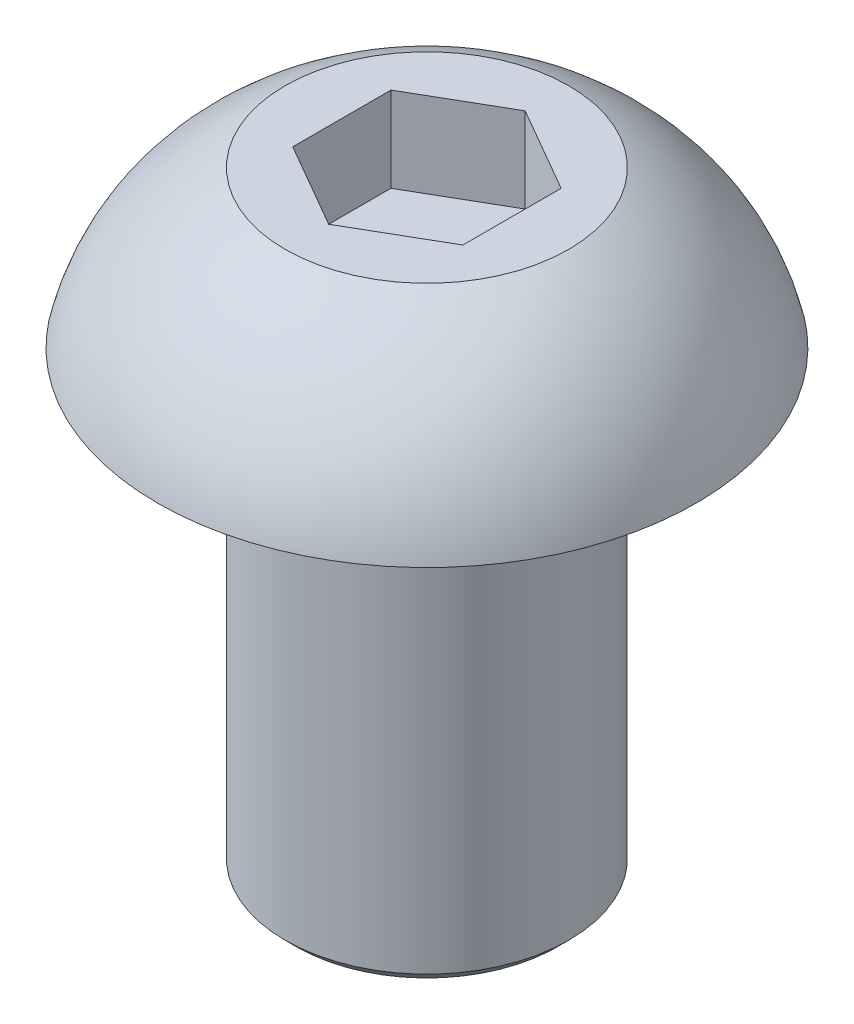
ISO-10303-21;
HEADER;
FILE_DESCRIPTION(('STEP AP214'),'2;1');
FILE_NAME('part.step','',(''),(''),'','','');
FILE_SCHEMA(('AUTOMOTIVE_DESIGN { 1 0 10303 214 1 1 1 1 }'));
ENDSEC;
DATA;
#1=APPLICATION_CONTEXT('core data for automotive mechanical design processes');
#2=APPLICATION_PROTOCOL_DEFINITION('international standard','automotive_design',2000,#1);
#3=PRODUCT_CONTEXT('',#1,'mechanical');
#4=PRODUCT('Part','Part','',(#3));
#5=PRODUCT_RELATED_PRODUCT_CATEGORY('part','',(#4));
#6=PRODUCT_DEFINITION_FORMATION('','',#4);
#7=PRODUCT_DEFINITION_CONTEXT('part definition',#1,'design');
#8=PRODUCT_DEFINITION('design','',#6,#7);
#9=PRODUCT_DEFINITION_SHAPE('','',#8);
#10=(LENGTH_UNIT() NAMED_UNIT(*) SI_UNIT(.MILLI.,.METRE.));
#11=(NAMED_UNIT(*) PLANE_ANGLE_UNIT() SI_UNIT($,.RADIAN.));
#12=(NAMED_UNIT(*) SI_UNIT($,.STERADIAN.) SOLID_ANGLE_UNIT());
#13=UNCERTAINTY_MEASURE_WITH_UNIT(LENGTH_MEASURE(1.E-05),#10,'distance_accuracy_value','');
#14=(GEOMETRIC_REPRESENTATION_CONTEXT(3) GLOBAL_UNCERTAINTY_ASSIGNED_CONTEXT((#13)) GLOBAL_UNIT_ASSIGNED_CONTEXT((#10,
#11,#12)) REPRESENTATION_CONTEXT('',''));
#15=CARTESIAN_POINT('',(0.,0.,0.));
#16=DIRECTION('',(0.,0.,1.));
#17=DIRECTION('',(1.,0.,0.));
#18=AXIS2_PLACEMENT_3D('',#15,#16,#17);
#19=CARTESIAN_POINT('',(0.,2.75,0.));
#20=DIRECTION('',(0.,1.,0.));
#21=DIRECTION('',(0.,0.,1.));
#22=AXIS2_PLACEMENT_3D('',#19,#20,#21);
#23=PLANE('',#22);
#24=DIRECTION('',(-0.866025403784439,0.,0.5));
#25=VECTOR('',#24,1.);
#26=CARTESIAN_POINT('',(0.,2.75,-1.73205080756887));
#27=LINE('',#26,#25);
#28=CARTESIAN_POINT('',(0.,2.75,-1.73205080756887));
#29=VERTEX_POINT('',#28);
#30=CARTESIAN_POINT('',(-1.5,2.75,-0.866025403784439));
#31=VERTEX_POINT('',#30);
#32=EDGE_CURVE('E32',#29,#31,#27,.T.);
#33=ORIENTED_EDGE('',*,*,#32,.F.);
#34=DIRECTION('',(-0.866025403784439,0.,-0.5));
#35=VECTOR('',#34,1.);
#36=CARTESIAN_POINT('',(1.5,2.75,-0.866025403784439));
#37=LINE('',#36,#35);
#38=CARTESIAN_POINT('',(1.5,2.75,-0.866025403784439));
#39=VERTEX_POINT('',#38);
#40=EDGE_CURVE('E115',#39,#29,#37,.T.);
#41=ORIENTED_EDGE('',*,*,#40,.F.);
#42=DIRECTION('',(0.,0.,-1.));
#43=VECTOR('',#42,1.);
#44=CARTESIAN_POINT('',(1.5,2.75,0.866025403784438));
#45=LINE('',#44,#43);
#46=CARTESIAN_POINT('',(1.5,2.75,0.866025403784438));
#47=VERTEX_POINT('',#46);
#48=EDGE_CURVE('E113',#47,#39,#45,.T.);
#49=ORIENTED_EDGE('',*,*,#48,.F.);
#50=DIRECTION('',(0.866025403784439,0.,-0.5));
#51=VECTOR('',#50,1.);
#52=CARTESIAN_POINT('',(0.,2.75,1.73205080756887));
#53=LINE('',#52,#51);
#54=CARTESIAN_POINT('',(0.,2.75,1.73205080756887));
#55=VERTEX_POINT('',#54);
#56=EDGE_CURVE('E80',#55,#47,#53,.T.);
#57=ORIENTED_EDGE('',*,*,#56,.F.);
#58=DIRECTION('',(0.866025403784439,0.,0.5));
#59=VECTOR('',#58,1.);
#60=CARTESIAN_POINT('',(-1.5,2.75,0.866025403784439));
#61=LINE('',#60,#59);
#62=CARTESIAN_POINT('',(-1.5,2.75,0.866025403784439));
#63=VERTEX_POINT('',#62);
#64=EDGE_CURVE('E109',#63,#55,#61,.T.);
#65=ORIENTED_EDGE('',*,*,#64,.F.);
#66=DIRECTION('',(0.,0.,1.));
#67=VECTOR('',#66,1.);
#68=CARTESIAN_POINT('',(-1.5,2.75,-0.866025403784439));
#69=LINE('',#68,#67);
#70=EDGE_CURVE('E106',#31,#63,#69,.T.);
#71=ORIENTED_EDGE('',*,*,#70,.F.);
#72=EDGE_LOOP('',(#33,#41,#49,#57,#65,#71));
#73=FACE_BOUND('',#72,.T.);
#74=CARTESIAN_POINT('',(0.,2.75,0.));
#75=DIRECTION('',(0.,1.,0.));
#76=DIRECTION('',(0.,0.,1.));
#77=AXIS2_PLACEMENT_3D('',#74,#75,#76);
#78=CIRCLE('',#77,2.5);
#79=CARTESIAN_POINT('',(0.,2.75,2.5));
#80=VERTEX_POINT('',#79);
#81=EDGE_CURVE('E130',#80,#80,#78,.T.);
#82=ORIENTED_EDGE('',*,*,#81,.T.);
#83=EDGE_LOOP('',(#82));
#84=FACE_BOUND('',#83,.T.);
#85=ADVANCED_FACE('F17',(#73,#84),#23,.T.);
#86=CARTESIAN_POINT('',(0.,-0.894408862271936,0.));
#87=DIRECTION('',(0.,1.,0.));
#88=DIRECTION('',(0.,0.,1.));
#89=AXIS2_PLACEMENT_3D('',#86,#87,#88);
#90=DEGENERATE_TOROIDAL_SURFACE('',#89,0.851278057223178,4.,.T.);
#91=CARTESIAN_POINT('',(0.,0.,0.));
#92=DIRECTION('',(0.,1.,0.));
#93=DIRECTION('',(0.,0.,1.));
#94=AXIS2_PLACEMENT_3D('',#91,#92,#93);
#95=CIRCLE('',#94,4.75);
#96=CARTESIAN_POINT('',(0.,0.,4.75));
#97=VERTEX_POINT('',#96);
#98=EDGE_CURVE('E127',#97,#97,#95,.T.);
#99=ORIENTED_EDGE('',*,*,#98,.T.);
#100=EDGE_LOOP('',(#99));
#101=FACE_BOUND('',#100,.T.);
#102=ORIENTED_EDGE('',*,*,#81,.F.);
#103=EDGE_LOOP('',(#102));
#104=FACE_BOUND('',#103,.T.);
#105=ADVANCED_FACE('F149',(#101,#104),#90,.T.);
#106=CARTESIAN_POINT('',(-2.5,0.,0.));
#107=DIRECTION('',(0.,-1.,0.));
#108=DIRECTION('',(0.,0.,-1.));
#109=AXIS2_PLACEMENT_3D('',#106,#107,#108);
#110=PLANE('',#109);
#111=CARTESIAN_POINT('',(0.,0.,0.));
#112=DIRECTION('',(0.,1.,0.));
#113=DIRECTION('',(0.,0.,1.));
#114=AXIS2_PLACEMENT_3D('',#111,#112,#113);
#115=CIRCLE('',#114,2.5);
#116=CARTESIAN_POINT('',(0.,0.,2.5));
#117=VERTEX_POINT('',#116);
#118=EDGE_CURVE('E119',#117,#117,#115,.T.);
#119=ORIENTED_EDGE('',*,*,#118,.T.);
#120=EDGE_LOOP('',(#119));
#121=FACE_BOUND('',#120,.T.);
#122=ORIENTED_EDGE('',*,*,#98,.F.);
#123=EDGE_LOOP('',(#122));
#124=FACE_BOUND('',#123,.T.);
#125=ADVANCED_FACE('F155',(#121,#124),#110,.T.);
#126=CARTESIAN_POINT('',(0.,60.1595545799248,0.));
#127=DIRECTION('',(0.,1.,0.));
#128=DIRECTION('',(0.,0.,1.));
#129=AXIS2_PLACEMENT_3D('',#126,#127,#128);
#130=CYLINDRICAL_SURFACE('',#129,2.5);
#131=CARTESIAN_POINT('',(0.,-7.8,0.));
#132=DIRECTION('',(0.,-1.,0.));
#133=DIRECTION('',(0.,0.,-1.));
#134=AXIS2_PLACEMENT_3D('',#131,#132,#133);
#135=CIRCLE('',#134,2.5);
#136=CARTESIAN_POINT('',(0.,-7.8,-2.5));
#137=VERTEX_POINT('',#136);
#138=EDGE_CURVE('E25',#137,#137,#135,.F.);
#139=ORIENTED_EDGE('',*,*,#138,.T.);
#140=EDGE_LOOP('',(#139));
#141=FACE_BOUND('',#140,.T.);
#142=ORIENTED_EDGE('',*,*,#118,.F.);
#143=EDGE_LOOP('',(#142));
#144=FACE_BOUND('',#143,.T.);
#145=ADVANCED_FACE('F135',(#141,#144),#130,.T.);
#146=CARTESIAN_POINT('',(0.,-8.,0.));
#147=DIRECTION('',(0.,-1.,0.));
#148=DIRECTION('',(0.,0.,-1.));
#149=AXIS2_PLACEMENT_3D('',#146,#147,#148);
#150=PLANE('',#149);
#151=CARTESIAN_POINT('',(0.,-8.,0.));
#152=DIRECTION('',(0.,-1.,0.));
#153=DIRECTION('',(0.,0.,-1.));
#154=AXIS2_PLACEMENT_3D('',#151,#152,#153);
#155=CIRCLE('',#154,2.3);
#156=CARTESIAN_POINT('',(0.,-8.,-2.3));
#157=VERTEX_POINT('',#156);
#158=EDGE_CURVE('E11',#157,#157,#155,.T.);
#159=ORIENTED_EDGE('',*,*,#158,.T.);
#160=EDGE_LOOP('',(#159));
#161=FACE_BOUND('',#160,.T.);
#162=ADVANCED_FACE('F165',(#161),#150,.T.);
#163=CARTESIAN_POINT('',(0.,1.25,-1.73205080756887));
#164=DIRECTION('',(-0.5,0.,-0.866025403784439));
#165=DIRECTION('',(-0.866025403784439,0.,0.5));
#166=AXIS2_PLACEMENT_3D('',#163,#164,#165);
#167=PLANE('',#166);
#168=ORIENTED_EDGE('',*,*,#32,.T.);
#169=DIRECTION('',(0.,1.,0.));
#170=VECTOR('',#169,1.);
#171=CARTESIAN_POINT('',(-1.5,1.25,-0.866025403784439));
#172=LINE('',#171,#170);
#173=CARTESIAN_POINT('',(-1.5,1.25,-0.866025403784439));
#174=VERTEX_POINT('',#173);
#175=EDGE_CURVE('E62',#174,#31,#172,.T.);
#176=ORIENTED_EDGE('',*,*,#175,.F.);
#177=DIRECTION('',(-0.866025403784439,0.,0.5));
#178=VECTOR('',#177,1.);
#179=CARTESIAN_POINT('',(0.,1.25,-1.73205080756887));
#180=LINE('',#179,#178);
#181=CARTESIAN_POINT('',(0.,1.25,-1.73205080756887));
#182=VERTEX_POINT('',#181);
#183=EDGE_CURVE('E117',#182,#174,#180,.T.);
#184=ORIENTED_EDGE('',*,*,#183,.F.);
#185=DIRECTION('',(0.,1.,0.));
#186=VECTOR('',#185,1.);
#187=CARTESIAN_POINT('',(0.,1.25,-1.73205080756887));
#188=LINE('',#187,#186);
#189=EDGE_CURVE('E40',#182,#29,#188,.T.);
#190=ORIENTED_EDGE('',*,*,#189,.T.);
#191=EDGE_LOOP('',(#168,#176,#184,#190));
#192=FACE_BOUND('',#191,.T.);
#193=ADVANCED_FACE('F168',(#192),#167,.F.);
#194=CARTESIAN_POINT('',(1.5,1.25,-0.866025403784439));
#195=DIRECTION('',(0.5,0.,-0.866025403784439));
#196=DIRECTION('',(-0.866025403784439,0.,-0.5));
#197=AXIS2_PLACEMENT_3D('',#194,#195,#196);
#198=PLANE('',#197);
#199=ORIENTED_EDGE('',*,*,#40,.T.);
#200=ORIENTED_EDGE('',*,*,#189,.F.);
#201=DIRECTION('',(-0.866025403784439,0.,-0.5));
#202=VECTOR('',#201,1.);
#203=CARTESIAN_POINT('',(1.5,1.25,-0.866025403784439));
#204=LINE('',#203,#202);
#205=CARTESIAN_POINT('',(1.5,1.25,-0.866025403784439));
#206=VERTEX_POINT('',#205);
#207=EDGE_CURVE('E92',#206,#182,#204,.T.);
#208=ORIENTED_EDGE('',*,*,#207,.F.);
#209=DIRECTION('',(0.,1.,0.));
#210=VECTOR('',#209,1.);
#211=CARTESIAN_POINT('',(1.5,1.25,-0.866025403784439));
#212=LINE('',#211,#210);
#213=EDGE_CURVE('E84',#206,#39,#212,.T.);
#214=ORIENTED_EDGE('',*,*,#213,.T.);
#215=EDGE_LOOP('',(#199,#200,#208,#214));
#216=FACE_BOUND('',#215,.T.);
#217=ADVANCED_FACE('F172',(#216),#198,.F.);
#218=CARTESIAN_POINT('',(1.5,1.25,0.866025403784438));
#219=DIRECTION('',(1.,0.,0.));
#220=DIRECTION('',(0.,0.,-1.));
#221=AXIS2_PLACEMENT_3D('',#218,#219,#220);
#222=PLANE('',#221);
#223=ORIENTED_EDGE('',*,*,#48,.T.);
#224=ORIENTED_EDGE('',*,*,#213,.F.);
#225=DIRECTION('',(0.,0.,-1.));
#226=VECTOR('',#225,1.);
#227=CARTESIAN_POINT('',(1.5,1.25,0.866025403784438));
#228=LINE('',#227,#226);
#229=CARTESIAN_POINT('',(1.5,1.25,0.866025403784438));
#230=VERTEX_POINT('',#229);
#231=EDGE_CURVE('E88',#230,#206,#228,.T.);
#232=ORIENTED_EDGE('',*,*,#231,.F.);
#233=DIRECTION('',(0.,1.,0.));
#234=VECTOR('',#233,1.);
#235=CARTESIAN_POINT('',(1.5,1.25,0.866025403784438));
#236=LINE('',#235,#234);
#237=EDGE_CURVE('E73',#230,#47,#236,.T.);
#238=ORIENTED_EDGE('',*,*,#237,.T.);
#239=EDGE_LOOP('',(#223,#224,#232,#238));
#240=FACE_BOUND('',#239,.T.);
#241=ADVANCED_FACE('F89',(#240),#222,.F.);
#242=CARTESIAN_POINT('',(0.,1.25,1.73205080756887));
#243=DIRECTION('',(0.5,0.,0.866025403784438));
#244=DIRECTION('',(0.866025403784439,0.,-0.5));
#245=AXIS2_PLACEMENT_3D('',#242,#243,#244);
#246=PLANE('',#245);
#247=ORIENTED_EDGE('',*,*,#56,.T.);
#248=ORIENTED_EDGE('',*,*,#237,.F.);
#249=DIRECTION('',(0.866025403784439,0.,-0.5));
#250=VECTOR('',#249,1.);
#251=CARTESIAN_POINT('',(0.,1.25,1.73205080756887));
#252=LINE('',#251,#250);
#253=CARTESIAN_POINT('',(0.,1.25,1.73205080756887));
#254=VERTEX_POINT('',#253);
#255=EDGE_CURVE('E77',#254,#230,#252,.T.);
#256=ORIENTED_EDGE('',*,*,#255,.F.);
#257=DIRECTION('',(0.,1.,0.));
#258=VECTOR('',#257,1.);
#259=CARTESIAN_POINT('',(0.,1.25,1.73205080756887));
#260=LINE('',#259,#258);
#261=EDGE_CURVE('E85',#254,#55,#260,.T.);
#262=ORIENTED_EDGE('',*,*,#261,.T.);
#263=EDGE_LOOP('',(#247,#248,#256,#262));
#264=FACE_BOUND('',#263,.T.);
#265=ADVANCED_FACE('F75',(#264),#246,.F.);
#266=CARTESIAN_POINT('',(-1.5,1.25,0.866025403784439));
#267=DIRECTION('',(-0.5,0.,0.866025403784439));
#268=DIRECTION('',(0.866025403784439,0.,0.5));
#269=AXIS2_PLACEMENT_3D('',#266,#267,#268);
#270=PLANE('',#269);
#271=ORIENTED_EDGE('',*,*,#64,.T.);
#272=ORIENTED_EDGE('',*,*,#261,.F.);
#273=DIRECTION('',(0.866025403784439,0.,0.5));
#274=VECTOR('',#273,1.);
#275=CARTESIAN_POINT('',(-1.5,1.25,0.866025403784439));
#276=LINE('',#275,#274);
#277=CARTESIAN_POINT('',(-1.5,1.25,0.866025403784439));
#278=VERTEX_POINT('',#277);
#279=EDGE_CURVE('E98',#278,#254,#276,.T.);
#280=ORIENTED_EDGE('',*,*,#279,.F.);
#281=DIRECTION('',(0.,1.,0.));
#282=VECTOR('',#281,1.);
#283=CARTESIAN_POINT('',(-1.5,1.25,0.866025403784439));
#284=LINE('',#283,#282);
#285=EDGE_CURVE('E122',#278,#63,#284,.T.);
#286=ORIENTED_EDGE('',*,*,#285,.T.);
#287=EDGE_LOOP('',(#271,#272,#280,#286));
#288=FACE_BOUND('',#287,.T.);
#289=ADVANCED_FACE('F175',(#288),#270,.F.);
#290=CARTESIAN_POINT('',(-1.5,1.25,-0.866025403784439));
#291=DIRECTION('',(-1.,0.,0.));
#292=DIRECTION('',(0.,0.,1.));
#293=AXIS2_PLACEMENT_3D('',#290,#291,#292);
#294=PLANE('',#293);
#295=ORIENTED_EDGE('',*,*,#70,.T.);
#296=ORIENTED_EDGE('',*,*,#285,.F.);
#297=DIRECTION('',(0.,0.,1.));
#298=VECTOR('',#297,1.);
#299=CARTESIAN_POINT('',(-1.5,1.25,-0.866025403784439));
#300=LINE('',#299,#298);
#301=EDGE_CURVE('E100',#174,#278,#300,.T.);
#302=ORIENTED_EDGE('',*,*,#301,.F.);
#303=ORIENTED_EDGE('',*,*,#175,.T.);
#304=EDGE_LOOP('',(#295,#296,#302,#303));
#305=FACE_BOUND('',#304,.T.);
#306=ADVANCED_FACE('F145',(#305),#294,.F.);
#307=CARTESIAN_POINT('',(0.,1.25,0.));
#308=DIRECTION('',(0.,1.,0.));
#309=DIRECTION('',(0.,0.,1.));
#310=AXIS2_PLACEMENT_3D('',#307,#308,#309);
#311=PLANE('',#310);
#312=ORIENTED_EDGE('',*,*,#183,.T.);
#313=ORIENTED_EDGE('',*,*,#301,.T.);
#314=ORIENTED_EDGE('',*,*,#279,.T.);
#315=ORIENTED_EDGE('',*,*,#255,.T.);
#316=ORIENTED_EDGE('',*,*,#231,.T.);
#317=ORIENTED_EDGE('',*,*,#207,.T.);
#318=EDGE_LOOP('',(#312,#313,#314,#315,#316,#317));
#319=FACE_BOUND('',#318,.T.);
#320=ADVANCED_FACE('F95',(#319),#311,.T.);
#321=CARTESIAN_POINT('',(0.,-7.8,0.));
#322=DIRECTION('',(0.,1.,0.));
#323=DIRECTION('',(0.,0.,1.));
#324=AXIS2_PLACEMENT_3D('',#321,#322,#323);
#325=CONICAL_SURFACE('',#324,2.5,0.785398163397445);
#326=ORIENTED_EDGE('',*,*,#158,.F.);
#327=EDGE_LOOP('',(#326));
#328=FACE_BOUND('',#327,.T.);
#329=ORIENTED_EDGE('',*,*,#138,.F.);
#330=EDGE_LOOP('',(#329));
#331=FACE_BOUND('',#330,.T.);
#332=ADVANCED_FACE('F19',(#328,#331),#325,.T.);
#333=CLOSED_SHELL('',(#85,#105,#125,#145,#162,#193,#217,#241,#265,#289,#306,#320,#332));
#334=MANIFOLD_SOLID_BREP('B1',#333);
#335=ADVANCED_BREP_SHAPE_REPRESENTATION('',(#18,#334),#14);
#336=SHAPE_DEFINITION_REPRESENTATION(#9,#335);
ENDSEC;
END-ISO-10303-21;
